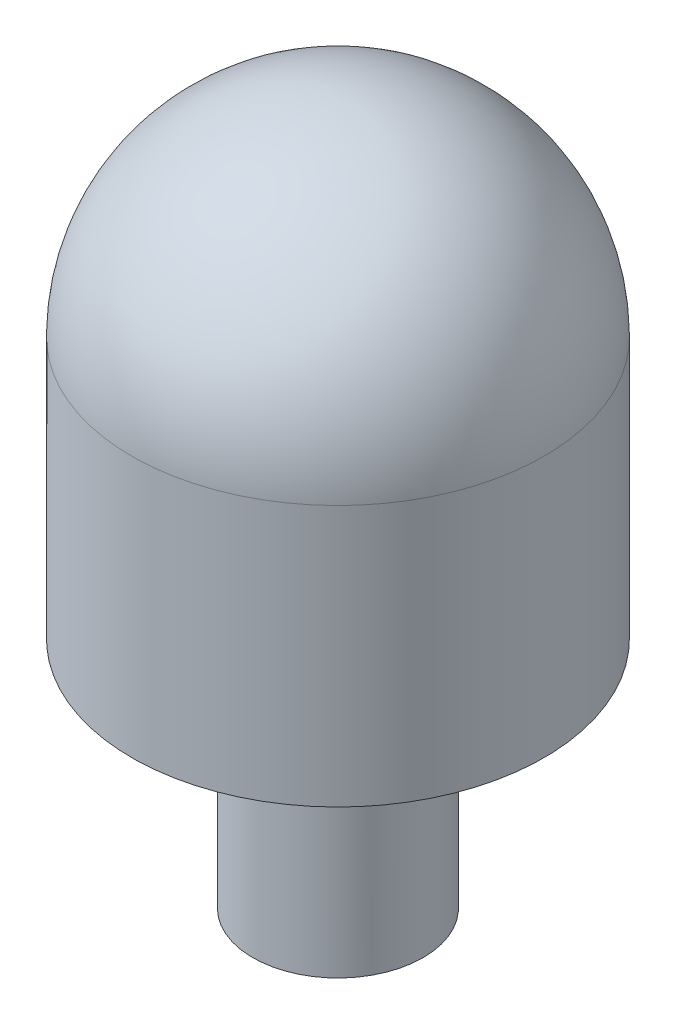
ISO-10303-21;
HEADER;
FILE_DESCRIPTION(('STEP AP214'),'2;1');
FILE_NAME('part.step','',(''),(''),'','','');
FILE_SCHEMA(('AUTOMOTIVE_DESIGN { 1 0 10303 214 1 1 1 1 }'));
ENDSEC;
DATA;
#1=APPLICATION_CONTEXT('core data for automotive mechanical design processes');
#2=APPLICATION_PROTOCOL_DEFINITION('international standard','automotive_design',2000,#1);
#3=PRODUCT_CONTEXT('',#1,'mechanical');
#4=PRODUCT('Part','Part','',(#3));
#5=PRODUCT_RELATED_PRODUCT_CATEGORY('part','',(#4));
#6=PRODUCT_DEFINITION_FORMATION('','',#4);
#7=PRODUCT_DEFINITION_CONTEXT('part definition',#1,'design');
#8=PRODUCT_DEFINITION('design','',#6,#7);
#9=PRODUCT_DEFINITION_SHAPE('','',#8);
#10=(LENGTH_UNIT() NAMED_UNIT(*) SI_UNIT(.MILLI.,.METRE.));
#11=(NAMED_UNIT(*) PLANE_ANGLE_UNIT() SI_UNIT($,.RADIAN.));
#12=(NAMED_UNIT(*) SI_UNIT($,.STERADIAN.) SOLID_ANGLE_UNIT());
#13=UNCERTAINTY_MEASURE_WITH_UNIT(LENGTH_MEASURE(1.E-05),#10,'distance_accuracy_value','');
#14=(GEOMETRIC_REPRESENTATION_CONTEXT(3) GLOBAL_UNCERTAINTY_ASSIGNED_CONTEXT((#13)) GLOBAL_UNIT_ASSIGNED_CONTEXT((#10,
#11,#12)) REPRESENTATION_CONTEXT('',''));
#15=CARTESIAN_POINT('',(0.,0.,0.));
#16=DIRECTION('',(0.,0.,1.));
#17=DIRECTION('',(1.,0.,0.));
#18=AXIS2_PLACEMENT_3D('',#15,#16,#17);
#19=CARTESIAN_POINT('',(0.,0.,0.));
#20=DIRECTION('',(0.,-1.,0.));
#21=DIRECTION('',(1.,0.,0.));
#22=AXIS2_PLACEMENT_3D('',#19,#20,#21);
#23=PLANE('',#22);
#24=CARTESIAN_POINT('',(0.,0.,0.));
#25=DIRECTION('',(0.,-1.,0.));
#26=DIRECTION('',(1.,0.,0.));
#27=AXIS2_PLACEMENT_3D('',#24,#25,#26);
#28=CIRCLE('',#27,2.1);
#29=CARTESIAN_POINT('',(2.1,0.,0.));
#30=VERTEX_POINT('',#29);
#31=EDGE_CURVE('E274',#30,#30,#28,.T.);
#32=ORIENTED_EDGE('',*,*,#31,.F.);
#33=EDGE_LOOP('',(#32));
#34=FACE_BOUND('',#33,.T.);
#35=CARTESIAN_POINT('',(0.,0.,0.));
#36=DIRECTION('',(0.,1.,0.));
#37=DIRECTION('',(-1.,0.,0.));
#38=AXIS2_PLACEMENT_3D('',#35,#36,#37);
#39=CIRCLE('',#38,7.5);
#40=CARTESIAN_POINT('',(-7.5,0.,0.));
#41=VERTEX_POINT('',#40);
#42=EDGE_CURVE('E11',#41,#41,#39,.T.);
#43=ORIENTED_EDGE('',*,*,#42,.F.);
#44=EDGE_LOOP('',(#43));
#45=FACE_BOUND('',#44,.T.);
#46=CARTESIAN_POINT('',(0.,0.,0.));
#47=DIRECTION('',(0.,-1.,0.));
#48=DIRECTION('',(1.,0.,0.));
#49=AXIS2_PLACEMENT_3D('',#46,#47,#48);
#50=CIRCLE('',#49,3.1);
#51=CARTESIAN_POINT('',(0.25,0.,3.08990291109608));
#52=VERTEX_POINT('',#51);
#53=CARTESIAN_POINT('',(-0.25,0.,3.08990291109608));
#54=VERTEX_POINT('',#53);
#55=EDGE_CURVE('E247',#52,#54,#50,.T.);
#56=ORIENTED_EDGE('',*,*,#55,.F.);
#57=DIRECTION('',(0.0806451612903226,0.,0.996742874547121));
#58=VECTOR('',#57,1.);
#59=CARTESIAN_POINT('',(0.209677419354839,0.,2.59153147382252));
#60=LINE('',#59,#58);
#61=CARTESIAN_POINT('',(0.209677419354839,0.,2.59153147382252));
#62=VERTEX_POINT('',#61);
#63=EDGE_CURVE('E242',#62,#52,#60,.T.);
#64=ORIENTED_EDGE('',*,*,#63,.F.);
#65=CARTESIAN_POINT('',(0.,0.,0.));
#66=DIRECTION('',(0.,1.,0.));
#67=DIRECTION('',(1.,0.,0.));
#68=AXIS2_PLACEMENT_3D('',#65,#66,#67);
#69=CIRCLE('',#68,2.6);
#70=CARTESIAN_POINT('',(-0.209677419354839,0.,2.59153147382252));
#71=VERTEX_POINT('',#70);
#72=EDGE_CURVE('E236',#71,#62,#69,.T.);
#73=ORIENTED_EDGE('',*,*,#72,.F.);
#74=DIRECTION('',(0.0806451612903227,0.,-0.996742874547121));
#75=VECTOR('',#74,1.);
#76=CARTESIAN_POINT('',(-0.25,0.,3.08990291109608));
#77=LINE('',#76,#75);
#78=EDGE_CURVE('E250',#54,#71,#77,.T.);
#79=ORIENTED_EDGE('',*,*,#78,.F.);
#80=EDGE_LOOP('',(#56,#64,#73,#79));
#81=FACE_BOUND('',#80,.T.);
#82=CARTESIAN_POINT('',(0.,0.,0.));
#83=DIRECTION('',(0.,-1.,0.));
#84=DIRECTION('',(1.,0.,0.));
#85=AXIS2_PLACEMENT_3D('',#82,#83,#84);
#86=CIRCLE('',#85,3.1);
#87=CARTESIAN_POINT('',(3.08990291109607,0.,-0.25000000000001));
#88=VERTEX_POINT('',#87);
#89=CARTESIAN_POINT('',(3.08990291109608,0.,0.24999999999999));
#90=VERTEX_POINT('',#89);
#91=EDGE_CURVE('E389',#88,#90,#86,.T.);
#92=ORIENTED_EDGE('',*,*,#91,.F.);
#93=DIRECTION('',(0.996742874547121,0.,-0.0806451612903261));
#94=VECTOR('',#93,1.);
#95=CARTESIAN_POINT('',(2.59153147382251,0.,-0.209677419354847));
#96=LINE('',#95,#94);
#97=CARTESIAN_POINT('',(2.59153147382251,0.,-0.209677419354847));
#98=VERTEX_POINT('',#97);
#99=EDGE_CURVE('E458',#98,#88,#96,.T.);
#100=ORIENTED_EDGE('',*,*,#99,.F.);
#101=CARTESIAN_POINT('',(0.,0.,0.));
#102=DIRECTION('',(0.,1.,0.));
#103=DIRECTION('',(1.,0.,0.));
#104=AXIS2_PLACEMENT_3D('',#101,#102,#103);
#105=CIRCLE('',#104,2.6);
#106=CARTESIAN_POINT('',(2.59153147382252,0.,0.20967741935483));
#107=VERTEX_POINT('',#106);
#108=EDGE_CURVE('E459',#107,#98,#105,.T.);
#109=ORIENTED_EDGE('',*,*,#108,.F.);
#110=DIRECTION('',(-0.996742874547121,0.,-0.0806451612903193));
#111=VECTOR('',#110,1.);
#112=CARTESIAN_POINT('',(3.08990291109608,0.,0.24999999999999));
#113=LINE('',#112,#111);
#114=EDGE_CURVE('E463',#90,#107,#113,.T.);
#115=ORIENTED_EDGE('',*,*,#114,.F.);
#116=EDGE_LOOP('',(#92,#100,#109,#115));
#117=FACE_BOUND('',#116,.T.);
#118=CARTESIAN_POINT('',(0.,0.,0.));
#119=DIRECTION('',(0.,-1.,0.));
#120=DIRECTION('',(1.,0.,0.));
#121=AXIS2_PLACEMENT_3D('',#118,#119,#120);
#122=CIRCLE('',#121,3.1);
#123=CARTESIAN_POINT('',(-0.250000000000021,0.,-3.08990291109607));
#124=VERTEX_POINT('',#123);
#125=CARTESIAN_POINT('',(0.249999999999978,0.,-3.08990291109608));
#126=VERTEX_POINT('',#125);
#127=EDGE_CURVE('E394',#124,#126,#122,.T.);
#128=ORIENTED_EDGE('',*,*,#127,.F.);
#129=DIRECTION('',(-0.0806451612903296,0.,-0.996742874547121));
#130=VECTOR('',#129,1.);
#131=CARTESIAN_POINT('',(-0.209677419354857,0.,-2.59153147382251));
#132=LINE('',#131,#130);
#133=CARTESIAN_POINT('',(-0.209677419354857,0.,-2.59153147382251));
#134=VERTEX_POINT('',#133);
#135=EDGE_CURVE('E425',#134,#124,#132,.T.);
#136=ORIENTED_EDGE('',*,*,#135,.F.);
#137=CARTESIAN_POINT('',(0.,0.,0.));
#138=DIRECTION('',(0.,1.,0.));
#139=DIRECTION('',(1.,0.,0.));
#140=AXIS2_PLACEMENT_3D('',#137,#138,#139);
#141=CIRCLE('',#140,2.6);
#142=CARTESIAN_POINT('',(0.209677419354821,0.,-2.59153147382252));
#143=VERTEX_POINT('',#142);
#144=EDGE_CURVE('E426',#143,#134,#141,.T.);
#145=ORIENTED_EDGE('',*,*,#144,.F.);
#146=DIRECTION('',(-0.0806451612903158,0.,0.996742874547122));
#147=VECTOR('',#146,1.);
#148=CARTESIAN_POINT('',(0.249999999999978,0.,-3.08990291109608));
#149=LINE('',#148,#147);
#150=EDGE_CURVE('E430',#126,#143,#149,.T.);
#151=ORIENTED_EDGE('',*,*,#150,.F.);
#152=EDGE_LOOP('',(#128,#136,#145,#151));
#153=FACE_BOUND('',#152,.T.);
#154=CARTESIAN_POINT('',(0.,0.,0.));
#155=DIRECTION('',(0.,-1.,0.));
#156=DIRECTION('',(1.,0.,0.));
#157=AXIS2_PLACEMENT_3D('',#154,#155,#156);
#158=CIRCLE('',#157,3.1);
#159=CARTESIAN_POINT('',(-3.08990291109607,0.,0.250000000000032));
#160=VERTEX_POINT('',#159);
#161=CARTESIAN_POINT('',(-3.08990291109608,0.,-0.249999999999968));
#162=VERTEX_POINT('',#161);
#163=EDGE_CURVE('E60',#160,#162,#158,.T.);
#164=ORIENTED_EDGE('',*,*,#163,.F.);
#165=DIRECTION('',(-0.99674287454712,0.,0.0806451612903331));
#166=VECTOR('',#165,1.);
#167=CARTESIAN_POINT('',(-2.59153147382251,0.,0.209677419354865));
#168=LINE('',#167,#166);
#169=CARTESIAN_POINT('',(-2.59153147382251,0.,0.209677419354865));
#170=VERTEX_POINT('',#169);
#171=EDGE_CURVE('E203',#170,#160,#168,.T.);
#172=ORIENTED_EDGE('',*,*,#171,.F.);
#173=CARTESIAN_POINT('',(0.,0.,0.));
#174=DIRECTION('',(0.,1.,0.));
#175=DIRECTION('',(1.,0.,0.));
#176=AXIS2_PLACEMENT_3D('',#173,#174,#175);
#177=CIRCLE('',#176,2.6);
#178=CARTESIAN_POINT('',(-2.59153147382252,0.,-0.209677419354812));
#179=VERTEX_POINT('',#178);
#180=EDGE_CURVE('E401',#179,#170,#177,.T.);
#181=ORIENTED_EDGE('',*,*,#180,.F.);
#182=DIRECTION('',(0.996742874547122,0.,0.0806451612903123));
#183=VECTOR('',#182,1.);
#184=CARTESIAN_POINT('',(-3.08990291109608,0.,-0.249999999999968));
#185=LINE('',#184,#183);
#186=EDGE_CURVE('E197',#162,#179,#185,.T.);
#187=ORIENTED_EDGE('',*,*,#186,.F.);
#188=EDGE_LOOP('',(#164,#172,#181,#187));
#189=FACE_BOUND('',#188,.T.);
#190=ADVANCED_FACE('F45',(#34,#45,#81,#117,#153,#189),#23,.T.);
#191=CARTESIAN_POINT('',(0.,-0.5,0.));
#192=DIRECTION('',(0.,-1.,0.));
#193=DIRECTION('',(1.,0.,0.));
#194=AXIS2_PLACEMENT_3D('',#191,#192,#193);
#195=PLANE('',#194);
#196=DIRECTION('',(-0.99674287454712,0.,0.0806451612903331));
#197=VECTOR('',#196,1.);
#198=CARTESIAN_POINT('',(-2.59153147382251,-0.5,0.209677419354865));
#199=LINE('',#198,#197);
#200=CARTESIAN_POINT('',(-2.59153147382251,-0.5,0.209677419354865));
#201=VERTEX_POINT('',#200);
#202=CARTESIAN_POINT('',(-3.08990291109607,-0.5,0.250000000000032));
#203=VERTEX_POINT('',#202);
#204=EDGE_CURVE('E212',#201,#203,#199,.T.);
#205=ORIENTED_EDGE('',*,*,#204,.T.);
#206=CARTESIAN_POINT('',(0.,-0.5,0.));
#207=DIRECTION('',(0.,-1.,0.));
#208=DIRECTION('',(1.,0.,0.));
#209=AXIS2_PLACEMENT_3D('',#206,#207,#208);
#210=CIRCLE('',#209,3.1);
#211=CARTESIAN_POINT('',(-0.25,-0.5,3.08990291109608));
#212=VERTEX_POINT('',#211);
#213=EDGE_CURVE('E237',#212,#203,#210,.T.);
#214=ORIENTED_EDGE('',*,*,#213,.F.);
#215=DIRECTION('',(0.0806451612903227,0.,-0.996742874547121));
#216=VECTOR('',#215,1.);
#217=CARTESIAN_POINT('',(-0.25,-0.5,3.08990291109608));
#218=LINE('',#217,#216);
#219=CARTESIAN_POINT('',(-0.209677419354839,-0.5,2.59153147382252));
#220=VERTEX_POINT('',#219);
#221=EDGE_CURVE('E270',#212,#220,#218,.T.);
#222=ORIENTED_EDGE('',*,*,#221,.T.);
#223=CARTESIAN_POINT('',(0.,-0.5,0.));
#224=DIRECTION('',(0.,-1.,0.));
#225=DIRECTION('',(1.,0.,0.));
#226=AXIS2_PLACEMENT_3D('',#223,#224,#225);
#227=CIRCLE('',#226,2.6);
#228=EDGE_CURVE('E221',#220,#201,#227,.T.);
#229=ORIENTED_EDGE('',*,*,#228,.T.);
#230=EDGE_LOOP('',(#205,#214,#222,#229));
#231=FACE_BOUND('',#230,.T.);
#232=ADVANCED_FACE('F369',(#231),#195,.F.);
#233=DIRECTION('',(0.996742874547122,0.,0.0806451612903123));
#234=VECTOR('',#233,1.);
#235=CARTESIAN_POINT('',(-3.08990291109608,-0.5,-0.249999999999968));
#236=LINE('',#235,#234);
#237=CARTESIAN_POINT('',(-3.08990291109608,-0.5,-0.249999999999968));
#238=VERTEX_POINT('',#237);
#239=CARTESIAN_POINT('',(-2.59153147382252,-0.5,-0.209677419354812));
#240=VERTEX_POINT('',#239);
#241=EDGE_CURVE('E194',#238,#240,#236,.T.);
#242=ORIENTED_EDGE('',*,*,#241,.T.);
#243=CARTESIAN_POINT('',(-0.209677419354857,-0.5,-2.59153147382251));
#244=VERTEX_POINT('',#243);
#245=EDGE_CURVE('E208',#240,#244,#227,.T.);
#246=ORIENTED_EDGE('',*,*,#245,.T.);
#247=DIRECTION('',(-0.0806451612903296,0.,-0.996742874547121));
#248=VECTOR('',#247,1.);
#249=CARTESIAN_POINT('',(-0.209677419354857,-0.5,-2.59153147382251));
#250=LINE('',#249,#248);
#251=CARTESIAN_POINT('',(-0.250000000000021,-0.5,-3.08990291109607));
#252=VERTEX_POINT('',#251);
#253=EDGE_CURVE('E406',#244,#252,#250,.T.);
#254=ORIENTED_EDGE('',*,*,#253,.T.);
#255=EDGE_CURVE('E210',#238,#252,#210,.T.);
#256=ORIENTED_EDGE('',*,*,#255,.F.);
#257=EDGE_LOOP('',(#242,#246,#254,#256));
#258=FACE_BOUND('',#257,.T.);
#259=ADVANCED_FACE('F206',(#258),#195,.F.);
#260=DIRECTION('',(-0.0806451612903158,0.,0.996742874547122));
#261=VECTOR('',#260,1.);
#262=CARTESIAN_POINT('',(0.249999999999978,-0.5,-3.08990291109608));
#263=LINE('',#262,#261);
#264=CARTESIAN_POINT('',(0.249999999999978,-0.5,-3.08990291109608));
#265=VERTEX_POINT('',#264);
#266=CARTESIAN_POINT('',(0.209677419354821,-0.5,-2.59153147382252));
#267=VERTEX_POINT('',#266);
#268=EDGE_CURVE('E409',#265,#267,#263,.T.);
#269=ORIENTED_EDGE('',*,*,#268,.T.);
#270=CARTESIAN_POINT('',(2.59153147382251,-0.5,-0.209677419354847));
#271=VERTEX_POINT('',#270);
#272=EDGE_CURVE('E222',#267,#271,#227,.T.);
#273=ORIENTED_EDGE('',*,*,#272,.T.);
#274=DIRECTION('',(0.996742874547121,0.,-0.0806451612903261));
#275=VECTOR('',#274,1.);
#276=CARTESIAN_POINT('',(2.59153147382251,-0.5,-0.209677419354847));
#277=LINE('',#276,#275);
#278=CARTESIAN_POINT('',(3.08990291109607,-0.5,-0.25000000000001));
#279=VERTEX_POINT('',#278);
#280=EDGE_CURVE('E439',#271,#279,#277,.T.);
#281=ORIENTED_EDGE('',*,*,#280,.T.);
#282=EDGE_CURVE('E488',#265,#279,#210,.T.);
#283=ORIENTED_EDGE('',*,*,#282,.F.);
#284=EDGE_LOOP('',(#269,#273,#281,#283));
#285=FACE_BOUND('',#284,.T.);
#286=ADVANCED_FACE('F366',(#285),#195,.F.);
#287=DIRECTION('',(-0.996742874547121,0.,-0.0806451612903193));
#288=VECTOR('',#287,1.);
#289=CARTESIAN_POINT('',(3.08990291109608,-0.5,0.24999999999999));
#290=LINE('',#289,#288);
#291=CARTESIAN_POINT('',(3.08990291109608,-0.5,0.24999999999999));
#292=VERTEX_POINT('',#291);
#293=CARTESIAN_POINT('',(2.59153147382252,-0.5,0.20967741935483));
#294=VERTEX_POINT('',#293);
#295=EDGE_CURVE('E429',#292,#294,#290,.T.);
#296=ORIENTED_EDGE('',*,*,#295,.T.);
#297=CARTESIAN_POINT('',(0.209677419354839,-0.5,2.59153147382252));
#298=VERTEX_POINT('',#297);
#299=EDGE_CURVE('E228',#294,#298,#227,.T.);
#300=ORIENTED_EDGE('',*,*,#299,.T.);
#301=DIRECTION('',(0.0806451612903227,0.,0.996742874547121));
#302=VECTOR('',#301,1.);
#303=CARTESIAN_POINT('',(0.209677419354839,-0.5,2.59153147382252));
#304=LINE('',#303,#302);
#305=CARTESIAN_POINT('',(0.25,-0.5,3.08990291109608));
#306=VERTEX_POINT('',#305);
#307=EDGE_CURVE('E269',#298,#306,#304,.T.);
#308=ORIENTED_EDGE('',*,*,#307,.T.);
#309=EDGE_CURVE('E241',#292,#306,#210,.T.);
#310=ORIENTED_EDGE('',*,*,#309,.F.);
#311=EDGE_LOOP('',(#296,#300,#308,#310));
#312=FACE_BOUND('',#311,.T.);
#313=ADVANCED_FACE('F358',(#312),#195,.F.);
#314=CARTESIAN_POINT('',(0.,17.,0.));
#315=DIRECTION('',(0.,1.,0.));
#316=DIRECTION('',(-1.,0.,0.));
#317=AXIS2_PLACEMENT_3D('',#314,#315,#316);
#318=CYLINDRICAL_SURFACE('',#317,7.5);
#319=ORIENTED_EDGE('',*,*,#42,.T.);
#320=EDGE_LOOP('',(#319));
#321=FACE_BOUND('',#320,.T.);
#322=CARTESIAN_POINT('',(0.,9.5,0.));
#323=DIRECTION('',(0.,1.,0.));
#324=DIRECTION('',(-1.,0.,0.));
#325=AXIS2_PLACEMENT_3D('',#322,#323,#324);
#326=CIRCLE('',#325,7.5);
#327=CARTESIAN_POINT('',(-7.5,9.5,0.));
#328=VERTEX_POINT('',#327);
#329=EDGE_CURVE('E53',#328,#328,#326,.T.);
#330=ORIENTED_EDGE('',*,*,#329,.F.);
#331=EDGE_LOOP('',(#330));
#332=FACE_BOUND('',#331,.T.);
#333=ADVANCED_FACE('F356',(#321,#332),#318,.T.);
#334=CARTESIAN_POINT('',(0.,9.5,0.));
#335=DIRECTION('',(0.,1.,0.));
#336=DIRECTION('',(-1.,0.,0.));
#337=AXIS2_PLACEMENT_3D('',#334,#335,#336);
#338=SPHERICAL_SURFACE('',#337,7.5);
#339=ORIENTED_EDGE('',*,*,#329,.T.);
#340=EDGE_LOOP('',(#339));
#341=FACE_BOUND('',#340,.T.);
#342=ADVANCED_FACE('F354',(#341),#338,.T.);
#343=CARTESIAN_POINT('',(0.,17.001,0.));
#344=DIRECTION('',(0.,-1.,0.));
#345=DIRECTION('',(1.,0.,0.));
#346=AXIS2_PLACEMENT_3D('',#343,#344,#345);
#347=CYLINDRICAL_SURFACE('',#346,2.1);
#348=ORIENTED_EDGE('',*,*,#31,.T.);
#349=EDGE_LOOP('',(#348));
#350=FACE_BOUND('',#349,.T.);
#351=CARTESIAN_POINT('',(0.,3.,0.));
#352=DIRECTION('',(0.,-1.,0.));
#353=DIRECTION('',(1.,0.,0.));
#354=AXIS2_PLACEMENT_3D('',#351,#352,#353);
#355=CIRCLE('',#354,2.1);
#356=CARTESIAN_POINT('',(2.1,3.,0.));
#357=VERTEX_POINT('',#356);
#358=EDGE_CURVE('E281',#357,#357,#355,.F.);
#359=ORIENTED_EDGE('',*,*,#358,.T.);
#360=EDGE_LOOP('',(#359));
#361=FACE_BOUND('',#360,.T.);
#362=ADVANCED_FACE('F363',(#350,#361),#347,.F.);
#363=CARTESIAN_POINT('',(2.13619599600161,6.2,3.7));
#364=DIRECTION('',(0.,0.,1.));
#365=DIRECTION('',(1.,0.,0.));
#366=AXIS2_PLACEMENT_3D('',#363,#364,#365);
#367=PLANE('',#366);
#368=DIRECTION('',(-1.,0.,0.));
#369=VECTOR('',#368,1.);
#370=CARTESIAN_POINT('',(2.13619599600161,3.,3.7));
#371=LINE('',#370,#369);
#372=CARTESIAN_POINT('',(2.13619599600161,3.,3.7));
#373=VERTEX_POINT('',#372);
#374=CARTESIAN_POINT('',(-2.13619599600162,3.,3.7));
#375=VERTEX_POINT('',#374);
#376=EDGE_CURVE('E285',#373,#375,#371,.T.);
#377=ORIENTED_EDGE('',*,*,#376,.T.);
#378=DIRECTION('',(0.,-1.,0.));
#379=VECTOR('',#378,1.);
#380=CARTESIAN_POINT('',(-2.13619599600162,6.2,3.7));
#381=LINE('',#380,#379);
#382=CARTESIAN_POINT('',(-2.13619599600162,6.2,3.7));
#383=VERTEX_POINT('',#382);
#384=EDGE_CURVE('E311',#383,#375,#381,.T.);
#385=ORIENTED_EDGE('',*,*,#384,.F.);
#386=DIRECTION('',(-1.,0.,0.));
#387=VECTOR('',#386,1.);
#388=CARTESIAN_POINT('',(2.13619599600161,6.2,3.7));
#389=LINE('',#388,#387);
#390=CARTESIAN_POINT('',(2.13619599600161,6.2,3.7));
#391=VERTEX_POINT('',#390);
#392=EDGE_CURVE('E286',#391,#383,#389,.T.);
#393=ORIENTED_EDGE('',*,*,#392,.F.);
#394=DIRECTION('',(0.,-1.,0.));
#395=VECTOR('',#394,1.);
#396=CARTESIAN_POINT('',(2.13619599600161,6.2,3.7));
#397=LINE('',#396,#395);
#398=EDGE_CURVE('E334',#391,#373,#397,.T.);
#399=ORIENTED_EDGE('',*,*,#398,.T.);
#400=EDGE_LOOP('',(#377,#385,#393,#399));
#401=FACE_BOUND('',#400,.T.);
#402=ADVANCED_FACE('F536',(#401),#367,.F.);
#403=CARTESIAN_POINT('',(4.27239199200323,6.2,0.));
#404=DIRECTION('',(0.866025403784439,0.,0.5));
#405=DIRECTION('',(0.5,0.,-0.866025403784439));
#406=AXIS2_PLACEMENT_3D('',#403,#404,#405);
#407=PLANE('',#406);
#408=DIRECTION('',(-0.5,0.,0.866025403784439));
#409=VECTOR('',#408,1.);
#410=CARTESIAN_POINT('',(4.27239199200323,3.,0.));
#411=LINE('',#410,#409);
#412=CARTESIAN_POINT('',(4.27239199200323,3.,0.));
#413=VERTEX_POINT('',#412);
#414=EDGE_CURVE('E291',#413,#373,#411,.T.);
#415=ORIENTED_EDGE('',*,*,#414,.T.);
#416=ORIENTED_EDGE('',*,*,#398,.F.);
#417=DIRECTION('',(-0.5,0.,0.866025403784439));
#418=VECTOR('',#417,1.);
#419=CARTESIAN_POINT('',(4.27239199200323,6.2,0.));
#420=LINE('',#419,#418);
#421=CARTESIAN_POINT('',(4.27239199200323,6.2,0.));
#422=VERTEX_POINT('',#421);
#423=EDGE_CURVE('E307',#422,#391,#420,.T.);
#424=ORIENTED_EDGE('',*,*,#423,.F.);
#425=DIRECTION('',(0.,-1.,0.));
#426=VECTOR('',#425,1.);
#427=CARTESIAN_POINT('',(4.27239199200323,6.2,0.));
#428=LINE('',#427,#426);
#429=EDGE_CURVE('E337',#422,#413,#428,.T.);
#430=ORIENTED_EDGE('',*,*,#429,.T.);
#431=EDGE_LOOP('',(#415,#416,#424,#430));
#432=FACE_BOUND('',#431,.T.);
#433=ADVANCED_FACE('F542',(#432),#407,.F.);
#434=CARTESIAN_POINT('',(2.13619599600161,6.2,-3.7));
#435=DIRECTION('',(0.866025403784438,0.,-0.5));
#436=DIRECTION('',(-0.5,0.,-0.866025403784439));
#437=AXIS2_PLACEMENT_3D('',#434,#435,#436);
#438=PLANE('',#437);
#439=DIRECTION('',(0.5,0.,0.866025403784438));
#440=VECTOR('',#439,1.);
#441=CARTESIAN_POINT('',(2.13619599600161,3.,-3.7));
#442=LINE('',#441,#440);
#443=CARTESIAN_POINT('',(2.13619599600161,3.,-3.7));
#444=VERTEX_POINT('',#443);
#445=EDGE_CURVE('E327',#444,#413,#442,.T.);
#446=ORIENTED_EDGE('',*,*,#445,.T.);
#447=ORIENTED_EDGE('',*,*,#429,.F.);
#448=DIRECTION('',(0.5,0.,0.866025403784438));
#449=VECTOR('',#448,1.);
#450=CARTESIAN_POINT('',(2.13619599600161,6.2,-3.7));
#451=LINE('',#450,#449);
#452=CARTESIAN_POINT('',(2.13619599600161,6.2,-3.7));
#453=VERTEX_POINT('',#452);
#454=EDGE_CURVE('E303',#453,#422,#451,.T.);
#455=ORIENTED_EDGE('',*,*,#454,.F.);
#456=DIRECTION('',(0.,-1.,0.));
#457=VECTOR('',#456,1.);
#458=CARTESIAN_POINT('',(2.13619599600161,6.2,-3.7));
#459=LINE('',#458,#457);
#460=EDGE_CURVE('E340',#453,#444,#459,.T.);
#461=ORIENTED_EDGE('',*,*,#460,.T.);
#462=EDGE_LOOP('',(#446,#447,#455,#461));
#463=FACE_BOUND('',#462,.T.);
#464=ADVANCED_FACE('F545',(#463),#438,.F.);
#465=CARTESIAN_POINT('',(-2.13619599600161,6.2,-3.7));
#466=DIRECTION('',(0.,0.,-1.));
#467=DIRECTION('',(-1.,0.,0.));
#468=AXIS2_PLACEMENT_3D('',#465,#466,#467);
#469=PLANE('',#468);
#470=DIRECTION('',(1.,0.,0.));
#471=VECTOR('',#470,1.);
#472=CARTESIAN_POINT('',(-2.13619599600161,3.,-3.7));
#473=LINE('',#472,#471);
#474=CARTESIAN_POINT('',(-2.13619599600161,3.,-3.7));
#475=VERTEX_POINT('',#474);
#476=EDGE_CURVE('E323',#475,#444,#473,.T.);
#477=ORIENTED_EDGE('',*,*,#476,.T.);
#478=ORIENTED_EDGE('',*,*,#460,.F.);
#479=DIRECTION('',(1.,0.,0.));
#480=VECTOR('',#479,1.);
#481=CARTESIAN_POINT('',(-2.13619599600161,6.2,-3.7));
#482=LINE('',#481,#480);
#483=CARTESIAN_POINT('',(-2.13619599600161,6.2,-3.7));
#484=VERTEX_POINT('',#483);
#485=EDGE_CURVE('E299',#484,#453,#482,.T.);
#486=ORIENTED_EDGE('',*,*,#485,.F.);
#487=DIRECTION('',(0.,-1.,0.));
#488=VECTOR('',#487,1.);
#489=CARTESIAN_POINT('',(-2.13619599600161,6.2,-3.7));
#490=LINE('',#489,#488);
#491=EDGE_CURVE('E343',#484,#475,#490,.T.);
#492=ORIENTED_EDGE('',*,*,#491,.T.);
#493=EDGE_LOOP('',(#477,#478,#486,#492));
#494=FACE_BOUND('',#493,.T.);
#495=ADVANCED_FACE('F549',(#494),#469,.F.);
#496=CARTESIAN_POINT('',(-4.27239199200323,6.2,0.));
#497=DIRECTION('',(-0.866025403784439,0.,-0.5));
#498=DIRECTION('',(-0.5,0.,0.866025403784439));
#499=AXIS2_PLACEMENT_3D('',#496,#497,#498);
#500=PLANE('',#499);
#501=DIRECTION('',(0.5,0.,-0.866025403784439));
#502=VECTOR('',#501,1.);
#503=CARTESIAN_POINT('',(-4.27239199200323,3.,0.));
#504=LINE('',#503,#502);
#505=CARTESIAN_POINT('',(-4.27239199200323,3.,0.));
#506=VERTEX_POINT('',#505);
#507=EDGE_CURVE('E319',#506,#475,#504,.T.);
#508=ORIENTED_EDGE('',*,*,#507,.T.);
#509=ORIENTED_EDGE('',*,*,#491,.F.);
#510=DIRECTION('',(0.5,0.,-0.866025403784439));
#511=VECTOR('',#510,1.);
#512=CARTESIAN_POINT('',(-4.27239199200323,6.2,0.));
#513=LINE('',#512,#511);
#514=CARTESIAN_POINT('',(-4.27239199200323,6.2,0.));
#515=VERTEX_POINT('',#514);
#516=EDGE_CURVE('E295',#515,#484,#513,.T.);
#517=ORIENTED_EDGE('',*,*,#516,.F.);
#518=DIRECTION('',(0.,-1.,0.));
#519=VECTOR('',#518,1.);
#520=CARTESIAN_POINT('',(-4.27239199200323,6.2,0.));
#521=LINE('',#520,#519);
#522=EDGE_CURVE('E346',#515,#506,#521,.T.);
#523=ORIENTED_EDGE('',*,*,#522,.T.);
#524=EDGE_LOOP('',(#508,#509,#517,#523));
#525=FACE_BOUND('',#524,.T.);
#526=ADVANCED_FACE('F553',(#525),#500,.F.);
#527=CARTESIAN_POINT('',(-2.13619599600162,6.2,3.7));
#528=DIRECTION('',(-0.866025403784439,0.,0.5));
#529=DIRECTION('',(0.5,0.,0.866025403784439));
#530=AXIS2_PLACEMENT_3D('',#527,#528,#529);
#531=PLANE('',#530);
#532=DIRECTION('',(-0.5,0.,-0.866025403784439));
#533=VECTOR('',#532,1.);
#534=CARTESIAN_POINT('',(-2.13619599600162,3.,3.7));
#535=LINE('',#534,#533);
#536=EDGE_CURVE('E315',#375,#506,#535,.T.);
#537=ORIENTED_EDGE('',*,*,#536,.T.);
#538=ORIENTED_EDGE('',*,*,#522,.F.);
#539=DIRECTION('',(-0.5,0.,-0.866025403784439));
#540=VECTOR('',#539,1.);
#541=CARTESIAN_POINT('',(-2.13619599600162,6.2,3.7));
#542=LINE('',#541,#540);
#543=EDGE_CURVE('E290',#383,#515,#542,.T.);
#544=ORIENTED_EDGE('',*,*,#543,.F.);
#545=ORIENTED_EDGE('',*,*,#384,.T.);
#546=EDGE_LOOP('',(#537,#538,#544,#545));
#547=FACE_BOUND('',#546,.T.);
#548=ADVANCED_FACE('F539',(#547),#531,.F.);
#549=CARTESIAN_POINT('',(0.,6.2,0.));
#550=DIRECTION('',(0.,-1.,0.));
#551=DIRECTION('',(1.,0.,0.));
#552=AXIS2_PLACEMENT_3D('',#549,#550,#551);
#553=PLANE('',#552);
#554=ORIENTED_EDGE('',*,*,#392,.T.);
#555=ORIENTED_EDGE('',*,*,#543,.T.);
#556=ORIENTED_EDGE('',*,*,#516,.T.);
#557=ORIENTED_EDGE('',*,*,#485,.T.);
#558=ORIENTED_EDGE('',*,*,#454,.T.);
#559=ORIENTED_EDGE('',*,*,#423,.T.);
#560=EDGE_LOOP('',(#554,#555,#556,#557,#558,#559));
#561=FACE_BOUND('',#560,.T.);
#562=ADVANCED_FACE('F527',(#561),#553,.T.);
#563=CARTESIAN_POINT('',(0.,3.,0.));
#564=DIRECTION('',(0.,-1.,0.));
#565=DIRECTION('',(1.,0.,0.));
#566=AXIS2_PLACEMENT_3D('',#563,#564,#565);
#567=PLANE('',#566);
#568=ORIENTED_EDGE('',*,*,#358,.F.);
#569=EDGE_LOOP('',(#568));
#570=FACE_BOUND('',#569,.T.);
#571=ORIENTED_EDGE('',*,*,#376,.F.);
#572=ORIENTED_EDGE('',*,*,#414,.F.);
#573=ORIENTED_EDGE('',*,*,#445,.F.);
#574=ORIENTED_EDGE('',*,*,#476,.F.);
#575=ORIENTED_EDGE('',*,*,#507,.F.);
#576=ORIENTED_EDGE('',*,*,#536,.F.);
#577=EDGE_LOOP('',(#571,#572,#573,#574,#575,#576));
#578=FACE_BOUND('',#577,.T.);
#579=ADVANCED_FACE('F517',(#570,#578),#567,.F.);
#580=CARTESIAN_POINT('',(0.209677419354838,-8.502,2.59153147382252));
#581=DIRECTION('',(-0.996742874547121,0.,0.0806451612903227));
#582=DIRECTION('',(0.0806451612903227,0.,0.996742874547121));
#583=AXIS2_PLACEMENT_3D('',#580,#581,#582);
#584=PLANE('',#583);
#585=ORIENTED_EDGE('',*,*,#307,.F.);
#586=DIRECTION('',(0.,1.,0.));
#587=VECTOR('',#586,1.);
#588=CARTESIAN_POINT('',(0.209677419354838,-8.502,2.59153147382252));
#589=LINE('',#588,#587);
#590=EDGE_CURVE('E266',#298,#62,#589,.T.);
#591=ORIENTED_EDGE('',*,*,#590,.T.);
#592=ORIENTED_EDGE('',*,*,#63,.T.);
#593=DIRECTION('',(0.,1.,0.));
#594=VECTOR('',#593,1.);
#595=CARTESIAN_POINT('',(0.25,-8.502,3.08990291109608));
#596=LINE('',#595,#594);
#597=EDGE_CURVE('E263',#306,#52,#596,.T.);
#598=ORIENTED_EDGE('',*,*,#597,.F.);
#599=EDGE_LOOP('',(#585,#591,#592,#598));
#600=FACE_BOUND('',#599,.T.);
#601=ADVANCED_FACE('F509',(#600),#584,.F.);
#602=CARTESIAN_POINT('',(0.,-8.502,0.));
#603=DIRECTION('',(0.,1.,0.));
#604=DIRECTION('',(-1.,0.,0.));
#605=AXIS2_PLACEMENT_3D('',#602,#603,#604);
#606=CYLINDRICAL_SURFACE('',#605,2.6);
#607=ORIENTED_EDGE('',*,*,#590,.F.);
#608=ORIENTED_EDGE('',*,*,#299,.F.);
#609=DIRECTION('',(0.,1.,0.));
#610=VECTOR('',#609,1.);
#611=CARTESIAN_POINT('',(2.59153147382252,-8.502,0.20967741935483));
#612=LINE('',#611,#610);
#613=EDGE_CURVE('E455',#294,#107,#612,.T.);
#614=ORIENTED_EDGE('',*,*,#613,.T.);
#615=ORIENTED_EDGE('',*,*,#108,.T.);
#616=DIRECTION('',(0.,1.,0.));
#617=VECTOR('',#616,1.);
#618=CARTESIAN_POINT('',(2.59153147382251,-8.502,-0.209677419354847));
#619=LINE('',#618,#617);
#620=EDGE_CURVE('E443',#271,#98,#619,.T.);
#621=ORIENTED_EDGE('',*,*,#620,.F.);
#622=ORIENTED_EDGE('',*,*,#272,.F.);
#623=DIRECTION('',(0.,1.,0.));
#624=VECTOR('',#623,1.);
#625=CARTESIAN_POINT('',(0.209677419354821,-8.502,-2.59153147382252));
#626=LINE('',#625,#624);
#627=EDGE_CURVE('E422',#267,#143,#626,.T.);
#628=ORIENTED_EDGE('',*,*,#627,.T.);
#629=ORIENTED_EDGE('',*,*,#144,.T.);
#630=DIRECTION('',(0.,1.,0.));
#631=VECTOR('',#630,1.);
#632=CARTESIAN_POINT('',(-0.209677419354857,-8.502,-2.59153147382251));
#633=LINE('',#632,#631);
#634=EDGE_CURVE('E219',#244,#134,#633,.T.);
#635=ORIENTED_EDGE('',*,*,#634,.F.);
#636=ORIENTED_EDGE('',*,*,#245,.F.);
#637=DIRECTION('',(0.,1.,0.));
#638=VECTOR('',#637,1.);
#639=CARTESIAN_POINT('',(-2.59153147382252,-8.502,-0.209677419354812));
#640=LINE('',#639,#638);
#641=EDGE_CURVE('E191',#240,#179,#640,.T.);
#642=ORIENTED_EDGE('',*,*,#641,.T.);
#643=ORIENTED_EDGE('',*,*,#180,.T.);
#644=DIRECTION('',(0.,1.,0.));
#645=VECTOR('',#644,1.);
#646=CARTESIAN_POINT('',(-2.59153147382251,-8.502,0.209677419354865));
#647=LINE('',#646,#645);
#648=EDGE_CURVE('E729',#201,#170,#647,.T.);
#649=ORIENTED_EDGE('',*,*,#648,.F.);
#650=ORIENTED_EDGE('',*,*,#228,.F.);
#651=DIRECTION('',(0.,1.,0.));
#652=VECTOR('',#651,1.);
#653=CARTESIAN_POINT('',(-0.209677419354839,-8.502,2.59153147382252));
#654=LINE('',#653,#652);
#655=EDGE_CURVE('E246',#220,#71,#654,.T.);
#656=ORIENTED_EDGE('',*,*,#655,.T.);
#657=ORIENTED_EDGE('',*,*,#72,.T.);
#658=EDGE_LOOP('',(#607,#608,#614,#615,#621,#622,#628,#629,#635,#636,#642,#643,#649,#650,#656,#657));
#659=FACE_BOUND('',#658,.T.);
#660=CARTESIAN_POINT('',(0.,-8.5,0.));
#661=DIRECTION('',(0.,-1.,0.));
#662=DIRECTION('',(1.,0.,0.));
#663=AXIS2_PLACEMENT_3D('',#660,#661,#662);
#664=CIRCLE('',#663,2.6);
#665=CARTESIAN_POINT('',(2.6,-8.5,0.));
#666=VERTEX_POINT('',#665);
#667=EDGE_CURVE('E227',#666,#666,#664,.T.);
#668=ORIENTED_EDGE('',*,*,#667,.T.);
#669=EDGE_LOOP('',(#668));
#670=FACE_BOUND('',#669,.T.);
#671=ADVANCED_FACE('F216',(#659,#670),#606,.F.);
#672=CARTESIAN_POINT('',(0.,-8.502,0.));
#673=DIRECTION('',(0.,1.,0.));
#674=DIRECTION('',(-1.,0.,0.));
#675=AXIS2_PLACEMENT_3D('',#672,#673,#674);
#676=CYLINDRICAL_SURFACE('',#675,3.1);
#677=DIRECTION('',(0.,1.,0.));
#678=VECTOR('',#677,1.);
#679=CARTESIAN_POINT('',(-0.25,-8.502,3.08990291109608));
#680=LINE('',#679,#678);
#681=EDGE_CURVE('E259',#212,#54,#680,.T.);
#682=ORIENTED_EDGE('',*,*,#681,.F.);
#683=ORIENTED_EDGE('',*,*,#213,.T.);
#684=DIRECTION('',(0.,1.,0.));
#685=VECTOR('',#684,1.);
#686=CARTESIAN_POINT('',(-3.08990291109607,-8.502,0.250000000000032));
#687=LINE('',#686,#685);
#688=EDGE_CURVE('E730',#203,#160,#687,.T.);
#689=ORIENTED_EDGE('',*,*,#688,.T.);
#690=ORIENTED_EDGE('',*,*,#163,.T.);
#691=DIRECTION('',(0.,1.,0.));
#692=VECTOR('',#691,1.);
#693=CARTESIAN_POINT('',(-3.08990291109608,-8.502,-0.249999999999968));
#694=LINE('',#693,#692);
#695=EDGE_CURVE('E64',#238,#162,#694,.T.);
#696=ORIENTED_EDGE('',*,*,#695,.F.);
#697=ORIENTED_EDGE('',*,*,#255,.T.);
#698=DIRECTION('',(0.,1.,0.));
#699=VECTOR('',#698,1.);
#700=CARTESIAN_POINT('',(-0.250000000000022,-8.502,-3.08990291109607));
#701=LINE('',#700,#699);
#702=EDGE_CURVE('E415',#252,#124,#701,.T.);
#703=ORIENTED_EDGE('',*,*,#702,.T.);
#704=ORIENTED_EDGE('',*,*,#127,.T.);
#705=DIRECTION('',(0.,1.,0.));
#706=VECTOR('',#705,1.);
#707=CARTESIAN_POINT('',(0.249999999999978,-8.502,-3.08990291109608));
#708=LINE('',#707,#706);
#709=EDGE_CURVE('E418',#265,#126,#708,.T.);
#710=ORIENTED_EDGE('',*,*,#709,.F.);
#711=ORIENTED_EDGE('',*,*,#282,.T.);
#712=DIRECTION('',(0.,1.,0.));
#713=VECTOR('',#712,1.);
#714=CARTESIAN_POINT('',(3.08990291109607,-8.502,-0.25000000000001));
#715=LINE('',#714,#713);
#716=EDGE_CURVE('E448',#279,#88,#715,.T.);
#717=ORIENTED_EDGE('',*,*,#716,.T.);
#718=ORIENTED_EDGE('',*,*,#91,.T.);
#719=DIRECTION('',(0.,1.,0.));
#720=VECTOR('',#719,1.);
#721=CARTESIAN_POINT('',(3.08990291109608,-8.502,0.24999999999999));
#722=LINE('',#721,#720);
#723=EDGE_CURVE('E451',#292,#90,#722,.T.);
#724=ORIENTED_EDGE('',*,*,#723,.F.);
#725=ORIENTED_EDGE('',*,*,#309,.T.);
#726=ORIENTED_EDGE('',*,*,#597,.T.);
#727=ORIENTED_EDGE('',*,*,#55,.T.);
#728=EDGE_LOOP('',(#682,#683,#689,#690,#696,#697,#703,#704,#710,#711,#717,#718,#724,#725,#726,#727));
#729=FACE_BOUND('',#728,.T.);
#730=CARTESIAN_POINT('',(0.,-8.5,0.));
#731=DIRECTION('',(0.,-1.,0.));
#732=DIRECTION('',(1.,0.,0.));
#733=AXIS2_PLACEMENT_3D('',#730,#731,#732);
#734=CIRCLE('',#733,3.1);
#735=CARTESIAN_POINT('',(3.1,-8.5,0.));
#736=VERTEX_POINT('',#735);
#737=EDGE_CURVE('E232',#736,#736,#734,.T.);
#738=ORIENTED_EDGE('',*,*,#737,.F.);
#739=EDGE_LOOP('',(#738));
#740=FACE_BOUND('',#739,.T.);
#741=ADVANCED_FACE('F484',(#729,#740),#676,.T.);
#742=CARTESIAN_POINT('',(-0.25,-8.502,3.08990291109608));
#743=DIRECTION('',(0.996742874547121,0.,0.0806451612903227));
#744=DIRECTION('',(0.0806451612903227,0.,-0.996742874547121));
#745=AXIS2_PLACEMENT_3D('',#742,#743,#744);
#746=PLANE('',#745);
#747=ORIENTED_EDGE('',*,*,#221,.F.);
#748=ORIENTED_EDGE('',*,*,#681,.T.);
#749=ORIENTED_EDGE('',*,*,#78,.T.);
#750=ORIENTED_EDGE('',*,*,#655,.F.);
#751=EDGE_LOOP('',(#747,#748,#749,#750));
#752=FACE_BOUND('',#751,.T.);
#753=ADVANCED_FACE('F506',(#752),#746,.F.);
#754=CARTESIAN_POINT('',(0.,-8.5,0.));
#755=DIRECTION('',(0.,-1.,0.));
#756=DIRECTION('',(1.,0.,0.));
#757=AXIS2_PLACEMENT_3D('',#754,#755,#756);
#758=PLANE('',#757);
#759=ORIENTED_EDGE('',*,*,#737,.T.);
#760=EDGE_LOOP('',(#759));
#761=FACE_BOUND('',#760,.T.);
#762=ORIENTED_EDGE('',*,*,#667,.F.);
#763=EDGE_LOOP('',(#762));
#764=FACE_BOUND('',#763,.T.);
#765=ADVANCED_FACE('F504',(#761,#764),#758,.T.);
#766=CARTESIAN_POINT('',(2.59153147382251,-8.502,-0.209677419354847));
#767=DIRECTION('',(0.0806451612903261,0.,0.996742874547121));
#768=DIRECTION('',(0.996742874547121,0.,-0.0806451612903261));
#769=AXIS2_PLACEMENT_3D('',#766,#767,#768);
#770=PLANE('',#769);
#771=ORIENTED_EDGE('',*,*,#280,.F.);
#772=ORIENTED_EDGE('',*,*,#620,.T.);
#773=ORIENTED_EDGE('',*,*,#99,.T.);
#774=ORIENTED_EDGE('',*,*,#716,.F.);
#775=EDGE_LOOP('',(#771,#772,#773,#774));
#776=FACE_BOUND('',#775,.T.);
#777=ADVANCED_FACE('F473',(#776),#770,.F.);
#778=CARTESIAN_POINT('',(3.08990291109608,-8.502,0.24999999999999));
#779=DIRECTION('',(0.0806451612903193,0.,-0.996742874547121));
#780=DIRECTION('',(-0.996742874547121,0.,-0.0806451612903193));
#781=AXIS2_PLACEMENT_3D('',#778,#779,#780);
#782=PLANE('',#781);
#783=ORIENTED_EDGE('',*,*,#295,.F.);
#784=ORIENTED_EDGE('',*,*,#723,.T.);
#785=ORIENTED_EDGE('',*,*,#114,.T.);
#786=ORIENTED_EDGE('',*,*,#613,.F.);
#787=EDGE_LOOP('',(#783,#784,#785,#786));
#788=FACE_BOUND('',#787,.T.);
#789=ADVANCED_FACE('F481',(#788),#782,.F.);
#790=CARTESIAN_POINT('',(-0.209677419354857,-8.502,-2.59153147382251));
#791=DIRECTION('',(0.996742874547121,0.,-0.0806451612903296));
#792=DIRECTION('',(-0.0806451612903296,0.,-0.996742874547121));
#793=AXIS2_PLACEMENT_3D('',#790,#791,#792);
#794=PLANE('',#793);
#795=ORIENTED_EDGE('',*,*,#253,.F.);
#796=ORIENTED_EDGE('',*,*,#634,.T.);
#797=ORIENTED_EDGE('',*,*,#135,.T.);
#798=ORIENTED_EDGE('',*,*,#702,.F.);
#799=EDGE_LOOP('',(#795,#796,#797,#798));
#800=FACE_BOUND('',#799,.T.);
#801=ADVANCED_FACE('F497',(#800),#794,.F.);
#802=CARTESIAN_POINT('',(0.249999999999978,-8.502,-3.08990291109608));
#803=DIRECTION('',(-0.996742874547122,0.,-0.0806451612903158));
#804=DIRECTION('',(-0.0806451612903158,0.,0.996742874547122));
#805=AXIS2_PLACEMENT_3D('',#802,#803,#804);
#806=PLANE('',#805);
#807=ORIENTED_EDGE('',*,*,#268,.F.);
#808=ORIENTED_EDGE('',*,*,#709,.T.);
#809=ORIENTED_EDGE('',*,*,#150,.T.);
#810=ORIENTED_EDGE('',*,*,#627,.F.);
#811=EDGE_LOOP('',(#807,#808,#809,#810));
#812=FACE_BOUND('',#811,.T.);
#813=ADVANCED_FACE('F494',(#812),#806,.F.);
#814=CARTESIAN_POINT('',(-2.59153147382251,-8.502,0.209677419354865));
#815=DIRECTION('',(-0.0806451612903331,0.,-0.99674287454712));
#816=DIRECTION('',(-0.99674287454712,0.,0.0806451612903331));
#817=AXIS2_PLACEMENT_3D('',#814,#815,#816);
#818=PLANE('',#817);
#819=ORIENTED_EDGE('',*,*,#204,.F.);
#820=ORIENTED_EDGE('',*,*,#648,.T.);
#821=ORIENTED_EDGE('',*,*,#171,.T.);
#822=ORIENTED_EDGE('',*,*,#688,.F.);
#823=EDGE_LOOP('',(#819,#820,#821,#822));
#824=FACE_BOUND('',#823,.T.);
#825=ADVANCED_FACE('F703',(#824),#818,.F.);
#826=CARTESIAN_POINT('',(-3.08990291109608,-8.502,-0.249999999999968));
#827=DIRECTION('',(-0.0806451612903123,0.,0.996742874547122));
#828=DIRECTION('',(0.996742874547122,0.,0.0806451612903123));
#829=AXIS2_PLACEMENT_3D('',#826,#827,#828);
#830=PLANE('',#829);
#831=ORIENTED_EDGE('',*,*,#241,.F.);
#832=ORIENTED_EDGE('',*,*,#695,.T.);
#833=ORIENTED_EDGE('',*,*,#186,.T.);
#834=ORIENTED_EDGE('',*,*,#641,.F.);
#835=EDGE_LOOP('',(#831,#832,#833,#834));
#836=FACE_BOUND('',#835,.T.);
#837=ADVANCED_FACE('F193',(#836),#830,.F.);
#838=CLOSED_SHELL('',(#190,#232,#259,#286,#313,#333,#342,#362,#402,#433,#464,#495,#526,#548,
#562,#579,#601,#671,#741,#753,#765,#777,#789,#801,#813,#825,#837));
#839=MANIFOLD_SOLID_BREP('B2',#838);
#840=ADVANCED_BREP_SHAPE_REPRESENTATION('',(#18,#839),#14);
#841=SHAPE_DEFINITION_REPRESENTATION(#9,#840);
ENDSEC;
END-ISO-10303-21;
